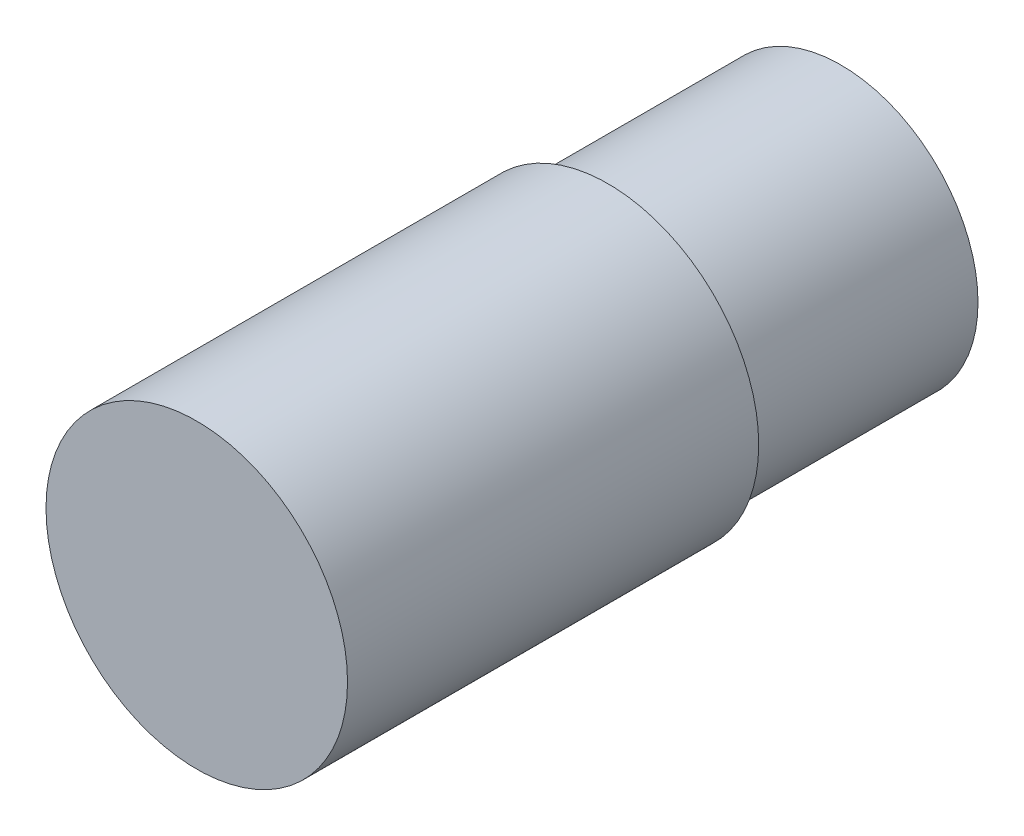
ISO-10303-21;
HEADER;
FILE_DESCRIPTION(('STEP AP214'),'2;1');
FILE_NAME('part.step','',(''),(''),'','','');
FILE_SCHEMA(('AUTOMOTIVE_DESIGN { 1 0 10303 214 1 1 1 1 }'));
ENDSEC;
DATA;
#1=APPLICATION_CONTEXT('core data for automotive mechanical design processes');
#2=APPLICATION_PROTOCOL_DEFINITION('international standard','automotive_design',2000,#1);
#3=PRODUCT_CONTEXT('',#1,'mechanical');
#4=PRODUCT('Part','Part','',(#3));
#5=PRODUCT_RELATED_PRODUCT_CATEGORY('part','',(#4));
#6=PRODUCT_DEFINITION_FORMATION('','',#4);
#7=PRODUCT_DEFINITION_CONTEXT('part definition',#1,'design');
#8=PRODUCT_DEFINITION('design','',#6,#7);
#9=PRODUCT_DEFINITION_SHAPE('','',#8);
#10=(LENGTH_UNIT() NAMED_UNIT(*) SI_UNIT(.MILLI.,.METRE.));
#11=(NAMED_UNIT(*) PLANE_ANGLE_UNIT() SI_UNIT($,.RADIAN.));
#12=(NAMED_UNIT(*) SI_UNIT($,.STERADIAN.) SOLID_ANGLE_UNIT());
#13=UNCERTAINTY_MEASURE_WITH_UNIT(LENGTH_MEASURE(1.E-05),#10,'distance_accuracy_value','');
#14=(GEOMETRIC_REPRESENTATION_CONTEXT(3) GLOBAL_UNCERTAINTY_ASSIGNED_CONTEXT((#13)) GLOBAL_UNIT_ASSIGNED_CONTEXT((#10,
#11,#12)) REPRESENTATION_CONTEXT('',''));
#15=CARTESIAN_POINT('',(0.,0.,0.));
#16=DIRECTION('',(0.,0.,1.));
#17=DIRECTION('',(1.,0.,0.));
#18=AXIS2_PLACEMENT_3D('',#15,#16,#17);
#19=CARTESIAN_POINT('',(0.,0.,17.));
#20=DIRECTION('',(0.,0.,-1.));
#21=DIRECTION('',(-1.,0.,0.));
#22=AXIS2_PLACEMENT_3D('',#19,#20,#21);
#23=CYLINDRICAL_SURFACE('',#22,10.);
#24=CARTESIAN_POINT('',(0.,0.,17.));
#25=DIRECTION('',(0.,0.,1.));
#26=DIRECTION('',(1.,0.,0.));
#27=AXIS2_PLACEMENT_3D('',#24,#25,#26);
#28=CIRCLE('',#27,10.);
#29=CARTESIAN_POINT('',(10.,0.,17.));
#30=VERTEX_POINT('',#29);
#31=EDGE_CURVE('E10',#30,#30,#28,.T.);
#32=ORIENTED_EDGE('',*,*,#31,.F.);
#33=EDGE_LOOP('',(#32));
#34=FACE_BOUND('',#33,.T.);
#35=CARTESIAN_POINT('',(0.,0.,0.));
#36=DIRECTION('',(0.,0.,1.));
#37=DIRECTION('',(1.,0.,0.));
#38=AXIS2_PLACEMENT_3D('',#35,#36,#37);
#39=CIRCLE('',#38,10.);
#40=CARTESIAN_POINT('',(10.,0.,0.));
#41=VERTEX_POINT('',#40);
#42=EDGE_CURVE('E34',#41,#41,#39,.T.);
#43=ORIENTED_EDGE('',*,*,#42,.T.);
#44=EDGE_LOOP('',(#43));
#45=FACE_BOUND('',#44,.T.);
#46=ADVANCED_FACE('F31',(#34,#45),#23,.T.);
#47=CARTESIAN_POINT('',(0.,0.,0.));
#48=DIRECTION('',(0.,0.,1.));
#49=DIRECTION('',(1.,0.,0.));
#50=AXIS2_PLACEMENT_3D('',#47,#48,#49);
#51=PLANE('',#50);
#52=ORIENTED_EDGE('',*,*,#42,.F.);
#53=EDGE_LOOP('',(#52));
#54=FACE_BOUND('',#53,.T.);
#55=ADVANCED_FACE('F54',(#54),#51,.F.);
#56=CARTESIAN_POINT('',(0.,0.,47.));
#57=DIRECTION('',(0.,0.,-1.));
#58=DIRECTION('',(-1.,0.,0.));
#59=AXIS2_PLACEMENT_3D('',#56,#57,#58);
#60=CYLINDRICAL_SURFACE('',#59,11.);
#61=CARTESIAN_POINT('',(0.,0.,47.));
#62=DIRECTION('',(0.,0.,1.));
#63=DIRECTION('',(1.,0.,0.));
#64=AXIS2_PLACEMENT_3D('',#61,#62,#63);
#65=CIRCLE('',#64,11.);
#66=CARTESIAN_POINT('',(11.,0.,47.));
#67=VERTEX_POINT('',#66);
#68=EDGE_CURVE('E41',#67,#67,#65,.T.);
#69=ORIENTED_EDGE('',*,*,#68,.F.);
#70=EDGE_LOOP('',(#69));
#71=FACE_BOUND('',#70,.T.);
#72=CARTESIAN_POINT('',(0.,0.,17.));
#73=DIRECTION('',(0.,0.,1.));
#74=DIRECTION('',(1.,0.,0.));
#75=AXIS2_PLACEMENT_3D('',#72,#73,#74);
#76=CIRCLE('',#75,11.);
#77=CARTESIAN_POINT('',(11.,0.,17.));
#78=VERTEX_POINT('',#77);
#79=EDGE_CURVE('E43',#78,#78,#76,.T.);
#80=ORIENTED_EDGE('',*,*,#79,.T.);
#81=EDGE_LOOP('',(#80));
#82=FACE_BOUND('',#81,.T.);
#83=ADVANCED_FACE('F51',(#71,#82),#60,.T.);
#84=CARTESIAN_POINT('',(0.,0.,47.));
#85=DIRECTION('',(0.,0.,1.));
#86=DIRECTION('',(1.,0.,0.));
#87=AXIS2_PLACEMENT_3D('',#84,#85,#86);
#88=PLANE('',#87);
#89=ORIENTED_EDGE('',*,*,#68,.T.);
#90=EDGE_LOOP('',(#89));
#91=FACE_BOUND('',#90,.T.);
#92=ADVANCED_FACE('F49',(#91),#88,.T.);
#93=CARTESIAN_POINT('',(0.,0.,17.));
#94=DIRECTION('',(0.,0.,1.));
#95=DIRECTION('',(1.,0.,0.));
#96=AXIS2_PLACEMENT_3D('',#93,#94,#95);
#97=PLANE('',#96);
#98=ORIENTED_EDGE('',*,*,#31,.T.);
#99=EDGE_LOOP('',(#98));
#100=FACE_BOUND('',#99,.T.);
#101=ORIENTED_EDGE('',*,*,#79,.F.);
#102=EDGE_LOOP('',(#101));
#103=FACE_BOUND('',#102,.T.);
#104=ADVANCED_FACE('F58',(#100,#103),#97,.F.);
#105=CLOSED_SHELL('',(#46,#55,#83,#92,#104));
#106=MANIFOLD_SOLID_BREP('B2',#105);
#107=ADVANCED_BREP_SHAPE_REPRESENTATION('',(#18,#106),#14);
#108=SHAPE_DEFINITION_REPRESENTATION(#9,#107);
ENDSEC;
END-ISO-10303-21;
